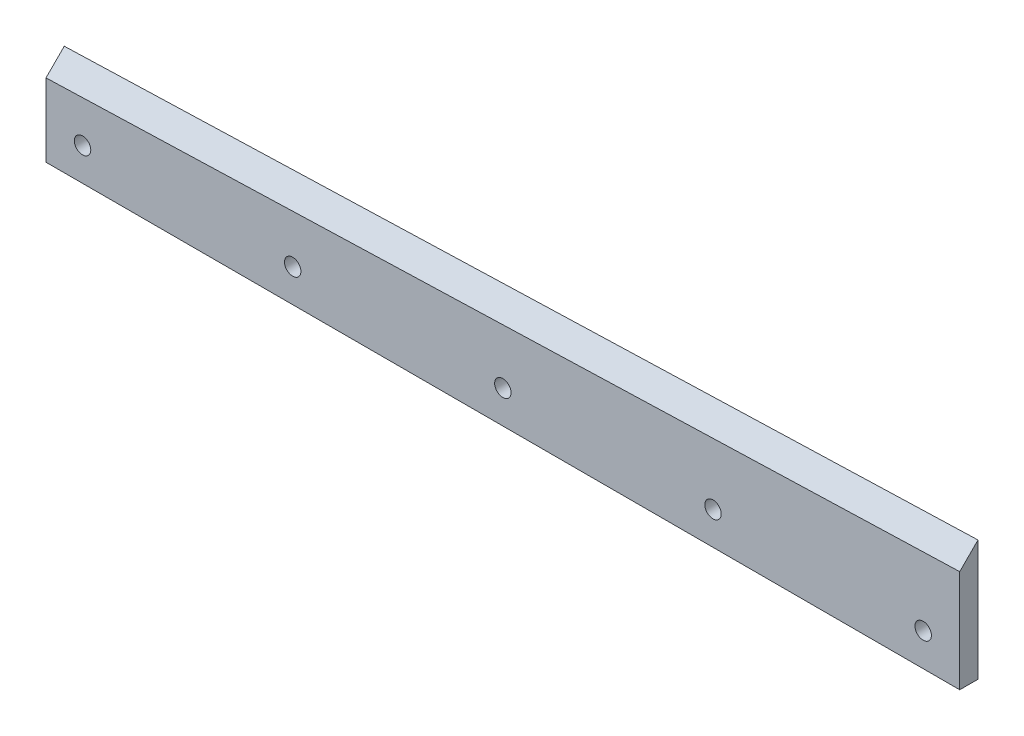
ISO-10303-21;
HEADER;
FILE_DESCRIPTION(('STEP AP214'),'2;1');
FILE_NAME('part.step','',(''),(''),'','','');
FILE_SCHEMA(('AUTOMOTIVE_DESIGN { 1 0 10303 214 1 1 1 1 }'));
ENDSEC;
DATA;
#1=APPLICATION_CONTEXT('core data for automotive mechanical design processes');
#2=APPLICATION_PROTOCOL_DEFINITION('international standard','automotive_design',2000,#1);
#3=PRODUCT_CONTEXT('',#1,'mechanical');
#4=PRODUCT('Part','Part','',(#3));
#5=PRODUCT_RELATED_PRODUCT_CATEGORY('part','',(#4));
#6=PRODUCT_DEFINITION_FORMATION('','',#4);
#7=PRODUCT_DEFINITION_CONTEXT('part definition',#1,'design');
#8=PRODUCT_DEFINITION('design','',#6,#7);
#9=PRODUCT_DEFINITION_SHAPE('','',#8);
#10=(LENGTH_UNIT() NAMED_UNIT(*) SI_UNIT(.MILLI.,.METRE.));
#11=(NAMED_UNIT(*) PLANE_ANGLE_UNIT() SI_UNIT($,.RADIAN.));
#12=(NAMED_UNIT(*) SI_UNIT($,.STERADIAN.) SOLID_ANGLE_UNIT());
#13=UNCERTAINTY_MEASURE_WITH_UNIT(LENGTH_MEASURE(1.E-05),#10,'distance_accuracy_value','');
#14=(GEOMETRIC_REPRESENTATION_CONTEXT(3) GLOBAL_UNCERTAINTY_ASSIGNED_CONTEXT((#13)) GLOBAL_UNIT_ASSIGNED_CONTEXT((#10,
#11,#12)) REPRESENTATION_CONTEXT('',''));
#15=CARTESIAN_POINT('',(0.,0.,0.));
#16=DIRECTION('',(0.,0.,1.));
#17=DIRECTION('',(1.,0.,0.));
#18=AXIS2_PLACEMENT_3D('',#15,#16,#17);
#19=CARTESIAN_POINT('',(250.,0.,5.));
#20=DIRECTION('',(0.,0.,-1.));
#21=DIRECTION('',(0.,1.,0.));
#22=AXIS2_PLACEMENT_3D('',#19,#20,#21);
#23=PLANE('',#22);
#24=CARTESIAN_POINT('',(9.99999999999998,9.,5.));
#25=DIRECTION('',(0.,0.,1.));
#26=DIRECTION('',(1.,0.,0.));
#27=AXIS2_PLACEMENT_3D('',#24,#25,#26);
#28=CIRCLE('',#27,2.25);
#29=CARTESIAN_POINT('',(12.25,9.,5.));
#30=VERTEX_POINT('',#29);
#31=EDGE_CURVE('E135',#30,#30,#28,.T.);
#32=ORIENTED_EDGE('',*,*,#31,.F.);
#33=EDGE_LOOP('',(#32));
#34=FACE_BOUND('',#33,.T.);
#35=DIRECTION('',(0.,-1.,0.));
#36=VECTOR('',#35,1.);
#37=CARTESIAN_POINT('',(250.,0.,5.));
#38=LINE('',#37,#36);
#39=CARTESIAN_POINT('',(250.,27.9974406550247,5.));
#40=VERTEX_POINT('',#39);
#41=CARTESIAN_POINT('',(250.,0.,5.));
#42=VERTEX_POINT('',#41);
#43=EDGE_CURVE('E89',#40,#42,#38,.T.);
#44=ORIENTED_EDGE('',*,*,#43,.F.);
#45=DIRECTION('',(-0.999488392880756,-0.0319836285721842,0.));
#46=VECTOR('',#45,1.);
#47=CARTESIAN_POINT('',(0.159918142860922,20.0025580355962,5.));
#48=LINE('',#47,#46);
#49=CARTESIAN_POINT('',(0.,19.9974406550246,5.));
#50=VERTEX_POINT('',#49);
#51=EDGE_CURVE('E40',#40,#50,#48,.T.);
#52=ORIENTED_EDGE('',*,*,#51,.T.);
#53=DIRECTION('',(0.,-1.,0.));
#54=VECTOR('',#53,1.);
#55=CARTESIAN_POINT('',(0.,0.,5.));
#56=LINE('',#55,#54);
#57=CARTESIAN_POINT('',(0.,0.,5.));
#58=VERTEX_POINT('',#57);
#59=EDGE_CURVE('E93',#50,#58,#56,.T.);
#60=ORIENTED_EDGE('',*,*,#59,.T.);
#61=DIRECTION('',(-1.,0.,0.));
#62=VECTOR('',#61,1.);
#63=CARTESIAN_POINT('',(250.,0.,5.));
#64=LINE('',#63,#62);
#65=EDGE_CURVE('E73',#42,#58,#64,.T.);
#66=ORIENTED_EDGE('',*,*,#65,.F.);
#67=EDGE_LOOP('',(#44,#52,#60,#66));
#68=FACE_BOUND('',#67,.T.);
#69=CARTESIAN_POINT('',(240.,9.,5.));
#70=DIRECTION('',(0.,0.,1.));
#71=DIRECTION('',(1.,0.,0.));
#72=AXIS2_PLACEMENT_3D('',#69,#70,#71);
#73=CIRCLE('',#72,2.25);
#74=CARTESIAN_POINT('',(242.25,9.,5.));
#75=VERTEX_POINT('',#74);
#76=EDGE_CURVE('E116',#75,#75,#73,.T.);
#77=ORIENTED_EDGE('',*,*,#76,.F.);
#78=EDGE_LOOP('',(#77));
#79=FACE_BOUND('',#78,.T.);
#80=CARTESIAN_POINT('',(182.5,9.,5.));
#81=DIRECTION('',(0.,0.,1.));
#82=DIRECTION('',(1.,0.,0.));
#83=AXIS2_PLACEMENT_3D('',#80,#81,#82);
#84=CIRCLE('',#83,2.25);
#85=CARTESIAN_POINT('',(184.75,9.,5.));
#86=VERTEX_POINT('',#85);
#87=EDGE_CURVE('E120',#86,#86,#84,.T.);
#88=ORIENTED_EDGE('',*,*,#87,.F.);
#89=EDGE_LOOP('',(#88));
#90=FACE_BOUND('',#89,.T.);
#91=CARTESIAN_POINT('',(125.,9.,5.));
#92=DIRECTION('',(0.,0.,1.));
#93=DIRECTION('',(1.,0.,0.));
#94=AXIS2_PLACEMENT_3D('',#91,#92,#93);
#95=CIRCLE('',#94,2.24999999999999);
#96=CARTESIAN_POINT('',(127.25,9.,5.));
#97=VERTEX_POINT('',#96);
#98=EDGE_CURVE('E124',#97,#97,#95,.T.);
#99=ORIENTED_EDGE('',*,*,#98,.F.);
#100=EDGE_LOOP('',(#99));
#101=FACE_BOUND('',#100,.T.);
#102=CARTESIAN_POINT('',(67.5,9.,5.));
#103=DIRECTION('',(0.,0.,1.));
#104=DIRECTION('',(1.,0.,0.));
#105=AXIS2_PLACEMENT_3D('',#102,#103,#104);
#106=CIRCLE('',#105,2.25);
#107=CARTESIAN_POINT('',(69.75,9.,5.));
#108=VERTEX_POINT('',#107);
#109=EDGE_CURVE('E127',#108,#108,#106,.T.);
#110=ORIENTED_EDGE('',*,*,#109,.F.);
#111=EDGE_LOOP('',(#110));
#112=FACE_BOUND('',#111,.T.);
#113=ADVANCED_FACE('F32',(#34,#68,#79,#90,#101,#112),#23,.F.);
#114=CARTESIAN_POINT('',(250.,0.,0.));
#115=DIRECTION('',(0.,0.,1.));
#116=DIRECTION('',(1.,0.,0.));
#117=AXIS2_PLACEMENT_3D('',#114,#115,#116);
#118=PLANE('',#117);
#119=CARTESIAN_POINT('',(9.99999999999998,9.,0.));
#120=DIRECTION('',(0.,0.,1.));
#121=DIRECTION('',(1.,0.,0.));
#122=AXIS2_PLACEMENT_3D('',#119,#120,#121);
#123=CIRCLE('',#122,2.25);
#124=CARTESIAN_POINT('',(12.25,9.,0.));
#125=VERTEX_POINT('',#124);
#126=EDGE_CURVE('E130',#125,#125,#123,.T.);
#127=ORIENTED_EDGE('',*,*,#126,.T.);
#128=EDGE_LOOP('',(#127));
#129=FACE_BOUND('',#128,.T.);
#130=CARTESIAN_POINT('',(67.5,9.,0.));
#131=DIRECTION('',(0.,0.,1.));
#132=DIRECTION('',(1.,0.,0.));
#133=AXIS2_PLACEMENT_3D('',#130,#131,#132);
#134=CIRCLE('',#133,2.25);
#135=CARTESIAN_POINT('',(69.75,9.,0.));
#136=VERTEX_POINT('',#135);
#137=EDGE_CURVE('E129',#136,#136,#134,.T.);
#138=ORIENTED_EDGE('',*,*,#137,.T.);
#139=EDGE_LOOP('',(#138));
#140=FACE_BOUND('',#139,.T.);
#141=CARTESIAN_POINT('',(125.,9.,0.));
#142=DIRECTION('',(0.,0.,1.));
#143=DIRECTION('',(1.,0.,0.));
#144=AXIS2_PLACEMENT_3D('',#141,#142,#143);
#145=CIRCLE('',#144,2.24999999999999);
#146=CARTESIAN_POINT('',(127.25,9.,0.));
#147=VERTEX_POINT('',#146);
#148=EDGE_CURVE('E140',#147,#147,#145,.T.);
#149=ORIENTED_EDGE('',*,*,#148,.T.);
#150=EDGE_LOOP('',(#149));
#151=FACE_BOUND('',#150,.T.);
#152=CARTESIAN_POINT('',(182.5,9.,0.));
#153=DIRECTION('',(0.,0.,1.));
#154=DIRECTION('',(1.,0.,0.));
#155=AXIS2_PLACEMENT_3D('',#152,#153,#154);
#156=CIRCLE('',#155,2.25);
#157=CARTESIAN_POINT('',(184.75,9.,0.));
#158=VERTEX_POINT('',#157);
#159=EDGE_CURVE('E144',#158,#158,#156,.T.);
#160=ORIENTED_EDGE('',*,*,#159,.T.);
#161=EDGE_LOOP('',(#160));
#162=FACE_BOUND('',#161,.T.);
#163=CARTESIAN_POINT('',(240.,9.,0.));
#164=DIRECTION('',(0.,0.,1.));
#165=DIRECTION('',(1.,0.,0.));
#166=AXIS2_PLACEMENT_3D('',#163,#164,#165);
#167=CIRCLE('',#166,2.25);
#168=CARTESIAN_POINT('',(242.25,9.,0.));
#169=VERTEX_POINT('',#168);
#170=EDGE_CURVE('E83',#169,#169,#167,.T.);
#171=ORIENTED_EDGE('',*,*,#170,.T.);
#172=EDGE_LOOP('',(#171));
#173=FACE_BOUND('',#172,.T.);
#174=DIRECTION('',(0.999488392880756,0.0319836285721842,0.));
#175=VECTOR('',#174,1.);
#176=CARTESIAN_POINT('',(0.,25.,0.));
#177=LINE('',#176,#175);
#178=CARTESIAN_POINT('',(0.,25.,0.));
#179=VERTEX_POINT('',#178);
#180=CARTESIAN_POINT('',(250.,33.,0.));
#181=VERTEX_POINT('',#180);
#182=EDGE_CURVE('E72',#179,#181,#177,.T.);
#183=ORIENTED_EDGE('',*,*,#182,.T.);
#184=DIRECTION('',(0.,1.,0.));
#185=VECTOR('',#184,1.);
#186=CARTESIAN_POINT('',(250.,0.,0.));
#187=LINE('',#186,#185);
#188=CARTESIAN_POINT('',(250.,0.,0.));
#189=VERTEX_POINT('',#188);
#190=EDGE_CURVE('E80',#189,#181,#187,.T.);
#191=ORIENTED_EDGE('',*,*,#190,.F.);
#192=DIRECTION('',(-1.,0.,0.));
#193=VECTOR('',#192,1.);
#194=CARTESIAN_POINT('',(250.,0.,0.));
#195=LINE('',#194,#193);
#196=CARTESIAN_POINT('',(0.,0.,0.));
#197=VERTEX_POINT('',#196);
#198=EDGE_CURVE('E98',#189,#197,#195,.T.);
#199=ORIENTED_EDGE('',*,*,#198,.T.);
#200=DIRECTION('',(0.,1.,0.));
#201=VECTOR('',#200,1.);
#202=CARTESIAN_POINT('',(0.,0.,0.));
#203=LINE('',#202,#201);
#204=EDGE_CURVE('E82',#197,#179,#203,.T.);
#205=ORIENTED_EDGE('',*,*,#204,.T.);
#206=EDGE_LOOP('',(#183,#191,#199,#205));
#207=FACE_BOUND('',#206,.T.);
#208=ADVANCED_FACE('F78',(#129,#140,#151,#162,#173,#207),#118,.F.);
#209=CARTESIAN_POINT('',(0.,33.,0.));
#210=DIRECTION('',(-1.,0.,0.));
#211=DIRECTION('',(0.,0.,1.));
#212=AXIS2_PLACEMENT_3D('',#209,#210,#211);
#213=PLANE('',#212);
#214=ORIENTED_EDGE('',*,*,#59,.F.);
#215=DIRECTION('',(0.,0.707287684747217,-0.706925831332341));
#216=VECTOR('',#215,1.);
#217=CARTESIAN_POINT('',(0.,29.0020469519606,-3.99999947624841));
#218=LINE('',#217,#216);
#219=EDGE_CURVE('E11',#50,#179,#218,.T.);
#220=ORIENTED_EDGE('',*,*,#219,.T.);
#221=ORIENTED_EDGE('',*,*,#204,.F.);
#222=DIRECTION('',(0.,0.,-1.));
#223=VECTOR('',#222,1.);
#224=CARTESIAN_POINT('',(0.,0.,0.));
#225=LINE('',#224,#223);
#226=EDGE_CURVE('E90',#58,#197,#225,.T.);
#227=ORIENTED_EDGE('',*,*,#226,.F.);
#228=EDGE_LOOP('',(#214,#220,#221,#227));
#229=FACE_BOUND('',#228,.T.);
#230=ADVANCED_FACE('F108',(#229),#213,.T.);
#231=CARTESIAN_POINT('',(250.,0.,0.));
#232=DIRECTION('',(0.,1.,0.));
#233=DIRECTION('',(0.,0.,1.));
#234=AXIS2_PLACEMENT_3D('',#231,#232,#233);
#235=PLANE('',#234);
#236=ORIENTED_EDGE('',*,*,#226,.T.);
#237=ORIENTED_EDGE('',*,*,#198,.F.);
#238=DIRECTION('',(0.,0.,-1.));
#239=VECTOR('',#238,1.);
#240=CARTESIAN_POINT('',(250.,0.,0.));
#241=LINE('',#240,#239);
#242=EDGE_CURVE('E87',#42,#189,#241,.T.);
#243=ORIENTED_EDGE('',*,*,#242,.F.);
#244=ORIENTED_EDGE('',*,*,#65,.T.);
#245=EDGE_LOOP('',(#236,#237,#243,#244));
#246=FACE_BOUND('',#245,.T.);
#247=ADVANCED_FACE('F106',(#246),#235,.F.);
#248=CARTESIAN_POINT('',(250.,33.,0.));
#249=DIRECTION('',(-1.,0.,0.));
#250=DIRECTION('',(0.,0.,1.));
#251=AXIS2_PLACEMENT_3D('',#248,#249,#250);
#252=PLANE('',#251);
#253=ORIENTED_EDGE('',*,*,#190,.T.);
#254=DIRECTION('',(0.,-0.707287684747217,0.706925831332341));
#255=VECTOR('',#254,1.);
#256=CARTESIAN_POINT('',(250.,28.9979530480394,3.99999947624845));
#257=LINE('',#256,#255);
#258=EDGE_CURVE('E54',#181,#40,#257,.T.);
#259=ORIENTED_EDGE('',*,*,#258,.T.);
#260=ORIENTED_EDGE('',*,*,#43,.T.);
#261=ORIENTED_EDGE('',*,*,#242,.T.);
#262=EDGE_LOOP('',(#253,#259,#260,#261));
#263=FACE_BOUND('',#262,.T.);
#264=ADVANCED_FACE('F85',(#263),#252,.F.);
#265=CARTESIAN_POINT('',(0.,25.,0.));
#266=DIRECTION('',(-0.0226158406503432,0.706745020323224,0.707106781186551));
#267=DIRECTION('',(0.,-0.707287684747217,0.706925831332341));
#268=AXIS2_PLACEMENT_3D('',#265,#266,#267);
#269=PLANE('',#268);
#270=ORIENTED_EDGE('',*,*,#219,.F.);
#271=ORIENTED_EDGE('',*,*,#51,.F.);
#272=ORIENTED_EDGE('',*,*,#258,.F.);
#273=ORIENTED_EDGE('',*,*,#182,.F.);
#274=EDGE_LOOP('',(#270,#271,#272,#273));
#275=FACE_BOUND('',#274,.T.);
#276=ADVANCED_FACE('F34',(#275),#269,.T.);
#277=CARTESIAN_POINT('',(240.,9.,5.));
#278=DIRECTION('',(0.,0.,1.));
#279=DIRECTION('',(1.,0.,0.));
#280=AXIS2_PLACEMENT_3D('',#277,#278,#279);
#281=CYLINDRICAL_SURFACE('',#280,2.25);
#282=ORIENTED_EDGE('',*,*,#170,.F.);
#283=EDGE_LOOP('',(#282));
#284=FACE_BOUND('',#283,.T.);
#285=ORIENTED_EDGE('',*,*,#76,.T.);
#286=EDGE_LOOP('',(#285));
#287=FACE_BOUND('',#286,.T.);
#288=ADVANCED_FACE('F151',(#284,#287),#281,.F.);
#289=CARTESIAN_POINT('',(182.5,9.,5.));
#290=DIRECTION('',(0.,0.,1.));
#291=DIRECTION('',(1.,0.,0.));
#292=AXIS2_PLACEMENT_3D('',#289,#290,#291);
#293=CYLINDRICAL_SURFACE('',#292,2.25);
#294=ORIENTED_EDGE('',*,*,#159,.F.);
#295=EDGE_LOOP('',(#294));
#296=FACE_BOUND('',#295,.T.);
#297=ORIENTED_EDGE('',*,*,#87,.T.);
#298=EDGE_LOOP('',(#297));
#299=FACE_BOUND('',#298,.T.);
#300=ADVANCED_FACE('F154',(#296,#299),#293,.F.);
#301=CARTESIAN_POINT('',(125.,9.,5.));
#302=DIRECTION('',(0.,0.,1.));
#303=DIRECTION('',(1.,0.,0.));
#304=AXIS2_PLACEMENT_3D('',#301,#302,#303);
#305=CYLINDRICAL_SURFACE('',#304,2.24999999999999);
#306=ORIENTED_EDGE('',*,*,#148,.F.);
#307=EDGE_LOOP('',(#306));
#308=FACE_BOUND('',#307,.T.);
#309=ORIENTED_EDGE('',*,*,#98,.T.);
#310=EDGE_LOOP('',(#309));
#311=FACE_BOUND('',#310,.T.);
#312=ADVANCED_FACE('F160',(#308,#311),#305,.F.);
#313=CARTESIAN_POINT('',(67.5,9.,5.));
#314=DIRECTION('',(0.,0.,1.));
#315=DIRECTION('',(1.,0.,0.));
#316=AXIS2_PLACEMENT_3D('',#313,#314,#315);
#317=CYLINDRICAL_SURFACE('',#316,2.25);
#318=ORIENTED_EDGE('',*,*,#137,.F.);
#319=EDGE_LOOP('',(#318));
#320=FACE_BOUND('',#319,.T.);
#321=ORIENTED_EDGE('',*,*,#109,.T.);
#322=EDGE_LOOP('',(#321));
#323=FACE_BOUND('',#322,.T.);
#324=ADVANCED_FACE('F185',(#320,#323),#317,.F.);
#325=CARTESIAN_POINT('',(9.99999999999998,9.,5.));
#326=DIRECTION('',(0.,0.,1.));
#327=DIRECTION('',(1.,0.,0.));
#328=AXIS2_PLACEMENT_3D('',#325,#326,#327);
#329=CYLINDRICAL_SURFACE('',#328,2.25);
#330=ORIENTED_EDGE('',*,*,#126,.F.);
#331=EDGE_LOOP('',(#330));
#332=FACE_BOUND('',#331,.T.);
#333=ORIENTED_EDGE('',*,*,#31,.T.);
#334=EDGE_LOOP('',(#333));
#335=FACE_BOUND('',#334,.T.);
#336=ADVANCED_FACE('F189',(#332,#335),#329,.F.);
#337=CLOSED_SHELL('',(#113,#208,#230,#247,#264,#276,#288,#300,#312,#324,#336));
#338=MANIFOLD_SOLID_BREP('B2',#337);
#339=ADVANCED_BREP_SHAPE_REPRESENTATION('',(#18,#338),#14);
#340=SHAPE_DEFINITION_REPRESENTATION(#9,#339);
ENDSEC;
END-ISO-10303-21;
